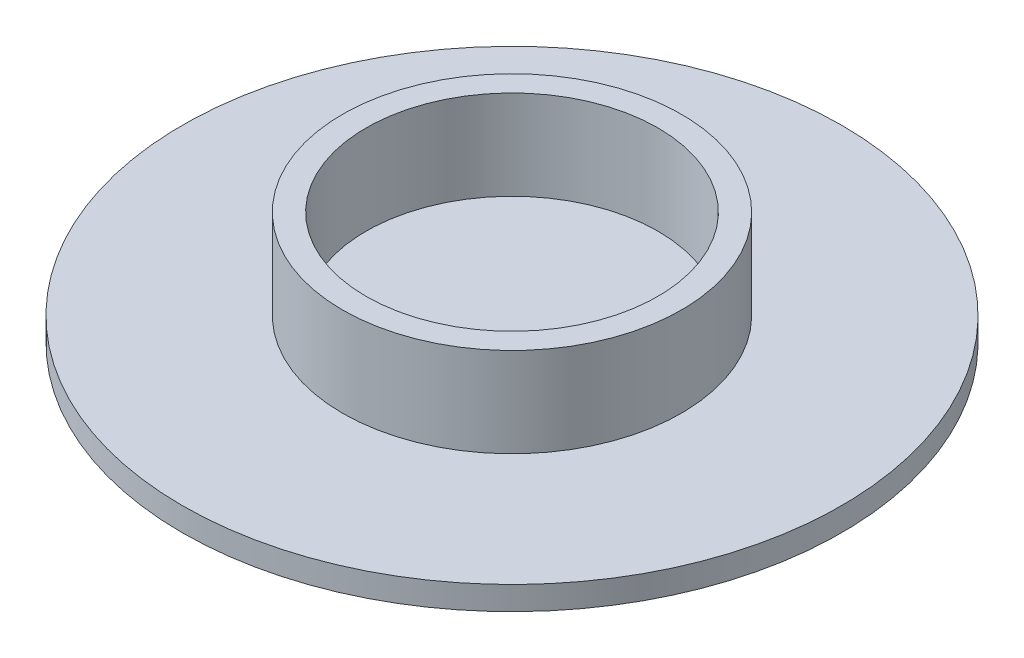
ISO-10303-21;
HEADER;
FILE_DESCRIPTION(('STEP AP214'),'2;1');
FILE_NAME('part.step','',(''),(''),'','','');
FILE_SCHEMA(('AUTOMOTIVE_DESIGN { 1 0 10303 214 1 1 1 1 }'));
ENDSEC;
DATA;
#1=APPLICATION_CONTEXT('core data for automotive mechanical design processes');
#2=APPLICATION_PROTOCOL_DEFINITION('international standard','automotive_design',2000,#1);
#3=PRODUCT_CONTEXT('',#1,'mechanical');
#4=PRODUCT('Part','Part','',(#3));
#5=PRODUCT_RELATED_PRODUCT_CATEGORY('part','',(#4));
#6=PRODUCT_DEFINITION_FORMATION('','',#4);
#7=PRODUCT_DEFINITION_CONTEXT('part definition',#1,'design');
#8=PRODUCT_DEFINITION('design','',#6,#7);
#9=PRODUCT_DEFINITION_SHAPE('','',#8);
#10=(LENGTH_UNIT() NAMED_UNIT(*) SI_UNIT(.MILLI.,.METRE.));
#11=(NAMED_UNIT(*) PLANE_ANGLE_UNIT() SI_UNIT($,.RADIAN.));
#12=(NAMED_UNIT(*) SI_UNIT($,.STERADIAN.) SOLID_ANGLE_UNIT());
#13=UNCERTAINTY_MEASURE_WITH_UNIT(LENGTH_MEASURE(1.E-05),#10,'distance_accuracy_value','');
#14=(GEOMETRIC_REPRESENTATION_CONTEXT(3) GLOBAL_UNCERTAINTY_ASSIGNED_CONTEXT((#13)) GLOBAL_UNIT_ASSIGNED_CONTEXT((#10,
#11,#12)) REPRESENTATION_CONTEXT('',''));
#15=CARTESIAN_POINT('',(0.,0.,0.));
#16=DIRECTION('',(0.,0.,1.));
#17=DIRECTION('',(1.,0.,0.));
#18=AXIS2_PLACEMENT_3D('',#15,#16,#17);
#19=CARTESIAN_POINT('',(0.,0.,0.));
#20=DIRECTION('',(0.,1.,0.));
#21=DIRECTION('',(0.,0.,1.));
#22=AXIS2_PLACEMENT_3D('',#19,#20,#21);
#23=PLANE('',#22);
#24=CARTESIAN_POINT('',(0.,0.,0.));
#25=DIRECTION('',(0.,1.,0.));
#26=DIRECTION('',(0.,0.,1.));
#27=AXIS2_PLACEMENT_3D('',#24,#25,#26);
#28=CIRCLE('',#27,70.);
#29=CARTESIAN_POINT('',(0.,0.,70.));
#30=VERTEX_POINT('',#29);
#31=EDGE_CURVE('E10',#30,#30,#28,.T.);
#32=ORIENTED_EDGE('',*,*,#31,.F.);
#33=EDGE_LOOP('',(#32));
#34=FACE_BOUND('',#33,.T.);
#35=ADVANCED_FACE('F31',(#34),#23,.F.);
#36=CARTESIAN_POINT('',(0.,4.99999999999999,0.));
#37=DIRECTION('',(0.,1.,0.));
#38=DIRECTION('',(0.,0.,1.));
#39=AXIS2_PLACEMENT_3D('',#36,#37,#38);
#40=CYLINDRICAL_SURFACE('',#39,70.);
#41=CARTESIAN_POINT('',(0.,5.,0.));
#42=DIRECTION('',(0.,1.,0.));
#43=DIRECTION('',(0.,0.,1.));
#44=AXIS2_PLACEMENT_3D('',#41,#42,#43);
#45=CIRCLE('',#44,70.);
#46=CARTESIAN_POINT('',(0.,5.,70.));
#47=VERTEX_POINT('',#46);
#48=EDGE_CURVE('E37',#47,#47,#45,.T.);
#49=ORIENTED_EDGE('',*,*,#48,.F.);
#50=EDGE_LOOP('',(#49));
#51=FACE_BOUND('',#50,.T.);
#52=ORIENTED_EDGE('',*,*,#31,.T.);
#53=EDGE_LOOP('',(#52));
#54=FACE_BOUND('',#53,.T.);
#55=ADVANCED_FACE('F79',(#51,#54),#40,.T.);
#56=CARTESIAN_POINT('',(0.,5.,-70.));
#57=DIRECTION('',(0.,-1.,0.));
#58=DIRECTION('',(0.,0.,-1.));
#59=AXIS2_PLACEMENT_3D('',#56,#57,#58);
#60=PLANE('',#59);
#61=CARTESIAN_POINT('',(0.,5.,0.));
#62=DIRECTION('',(0.,1.,0.));
#63=DIRECTION('',(0.,0.,1.));
#64=AXIS2_PLACEMENT_3D('',#61,#62,#63);
#65=CIRCLE('',#64,36.);
#66=CARTESIAN_POINT('',(0.,5.,36.));
#67=VERTEX_POINT('',#66);
#68=EDGE_CURVE('E41',#67,#67,#65,.T.);
#69=ORIENTED_EDGE('',*,*,#68,.F.);
#70=EDGE_LOOP('',(#69));
#71=FACE_BOUND('',#70,.T.);
#72=ORIENTED_EDGE('',*,*,#48,.T.);
#73=EDGE_LOOP('',(#72));
#74=FACE_BOUND('',#73,.T.);
#75=ADVANCED_FACE('F74',(#71,#74),#60,.F.);
#76=CARTESIAN_POINT('',(0.,4.99999999999999,0.));
#77=DIRECTION('',(0.,1.,0.));
#78=DIRECTION('',(0.,0.,1.));
#79=AXIS2_PLACEMENT_3D('',#76,#77,#78);
#80=CYLINDRICAL_SURFACE('',#79,36.);
#81=CARTESIAN_POINT('',(0.,24.,0.));
#82=DIRECTION('',(0.,1.,0.));
#83=DIRECTION('',(0.,0.,1.));
#84=AXIS2_PLACEMENT_3D('',#81,#82,#83);
#85=CIRCLE('',#84,36.);
#86=CARTESIAN_POINT('',(0.,24.,36.));
#87=VERTEX_POINT('',#86);
#88=EDGE_CURVE('E45',#87,#87,#85,.T.);
#89=ORIENTED_EDGE('',*,*,#88,.F.);
#90=EDGE_LOOP('',(#89));
#91=FACE_BOUND('',#90,.T.);
#92=ORIENTED_EDGE('',*,*,#68,.T.);
#93=EDGE_LOOP('',(#92));
#94=FACE_BOUND('',#93,.T.);
#95=ADVANCED_FACE('F68',(#91,#94),#80,.T.);
#96=CARTESIAN_POINT('',(0.,24.,-36.));
#97=DIRECTION('',(0.,-1.,0.));
#98=DIRECTION('',(0.,0.,-1.));
#99=AXIS2_PLACEMENT_3D('',#96,#97,#98);
#100=PLANE('',#99);
#101=CARTESIAN_POINT('',(0.,24.,0.));
#102=DIRECTION('',(0.,1.,0.));
#103=DIRECTION('',(0.,0.,1.));
#104=AXIS2_PLACEMENT_3D('',#101,#102,#103);
#105=CIRCLE('',#104,31.);
#106=CARTESIAN_POINT('',(0.,24.,31.));
#107=VERTEX_POINT('',#106);
#108=EDGE_CURVE('E50',#107,#107,#105,.T.);
#109=ORIENTED_EDGE('',*,*,#108,.F.);
#110=EDGE_LOOP('',(#109));
#111=FACE_BOUND('',#110,.T.);
#112=ORIENTED_EDGE('',*,*,#88,.T.);
#113=EDGE_LOOP('',(#112));
#114=FACE_BOUND('',#113,.T.);
#115=ADVANCED_FACE('F62',(#111,#114),#100,.F.);
#116=CARTESIAN_POINT('',(0.,4.99999999999999,0.));
#117=DIRECTION('',(0.,1.,0.));
#118=DIRECTION('',(0.,0.,1.));
#119=AXIS2_PLACEMENT_3D('',#116,#117,#118);
#120=CYLINDRICAL_SURFACE('',#119,31.);
#121=CARTESIAN_POINT('',(0.,5.,0.));
#122=DIRECTION('',(0.,1.,0.));
#123=DIRECTION('',(0.,0.,1.));
#124=AXIS2_PLACEMENT_3D('',#121,#122,#123);
#125=CIRCLE('',#124,31.);
#126=CARTESIAN_POINT('',(0.,5.,31.));
#127=VERTEX_POINT('',#126);
#128=EDGE_CURVE('E53',#127,#127,#125,.T.);
#129=ORIENTED_EDGE('',*,*,#128,.F.);
#130=EDGE_LOOP('',(#129));
#131=FACE_BOUND('',#130,.T.);
#132=ORIENTED_EDGE('',*,*,#108,.T.);
#133=EDGE_LOOP('',(#132));
#134=FACE_BOUND('',#133,.T.);
#135=ADVANCED_FACE('F59',(#131,#134),#120,.F.);
#136=CARTESIAN_POINT('',(0.,4.99999999999999,-31.));
#137=DIRECTION('',(0.,-1.,0.));
#138=DIRECTION('',(0.,0.,-1.));
#139=AXIS2_PLACEMENT_3D('',#136,#137,#138);
#140=PLANE('',#139);
#141=ORIENTED_EDGE('',*,*,#128,.T.);
#142=EDGE_LOOP('',(#141));
#143=FACE_BOUND('',#142,.T.);
#144=ADVANCED_FACE('F57',(#143),#140,.F.);
#145=CLOSED_SHELL('',(#35,#55,#75,#95,#115,#135,#144));
#146=MANIFOLD_SOLID_BREP('B2',#145);
#147=ADVANCED_BREP_SHAPE_REPRESENTATION('',(#18,#146),#14);
#148=SHAPE_DEFINITION_REPRESENTATION(#9,#147);
ENDSEC;
END-ISO-10303-21;
